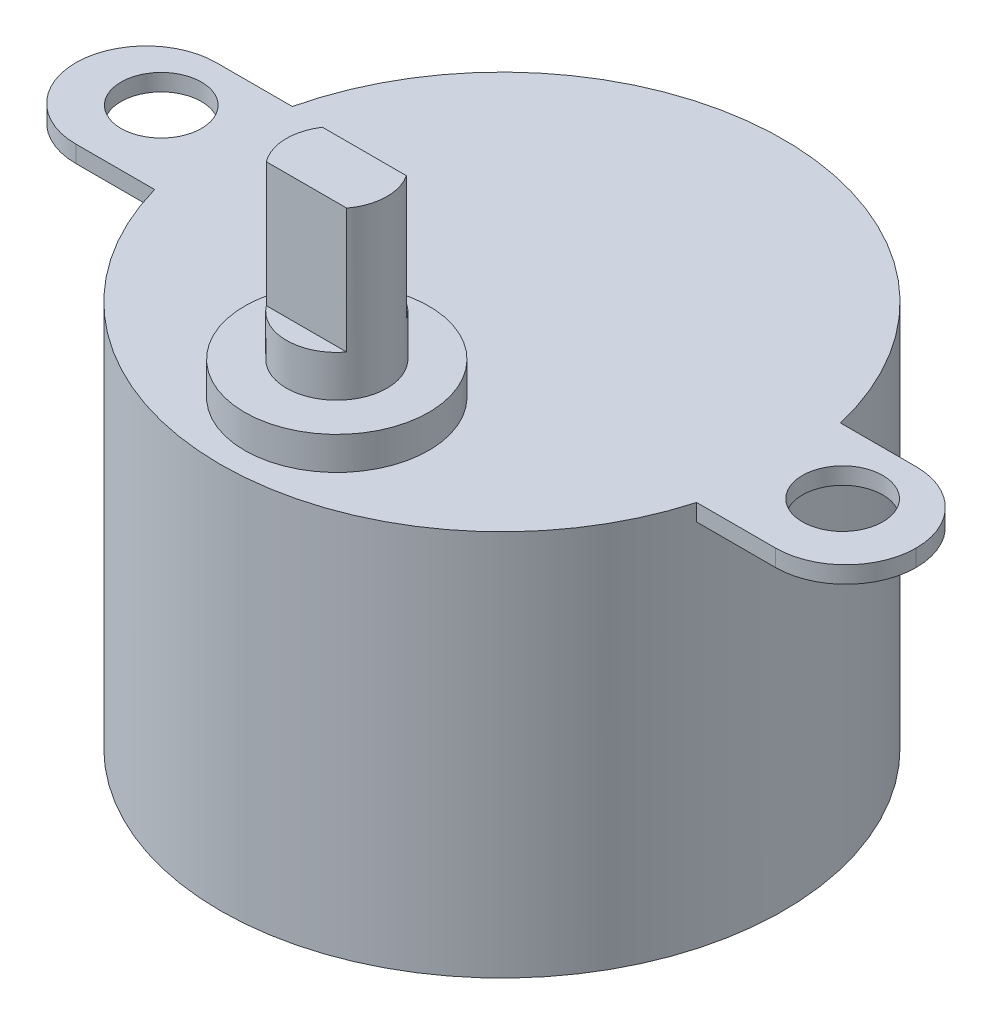
ISO-10303-21;
HEADER;
FILE_DESCRIPTION(('STEP AP214'),'2;1');
FILE_NAME('part.step','',(''),(''),'','','');
FILE_SCHEMA(('AUTOMOTIVE_DESIGN { 1 0 10303 214 1 1 1 1 }'));
ENDSEC;
DATA;
#1=APPLICATION_CONTEXT('core data for automotive mechanical design processes');
#2=APPLICATION_PROTOCOL_DEFINITION('international standard','automotive_design',2000,#1);
#3=PRODUCT_CONTEXT('',#1,'mechanical');
#4=PRODUCT('Part','Part','',(#3));
#5=PRODUCT_RELATED_PRODUCT_CATEGORY('part','',(#4));
#6=PRODUCT_DEFINITION_FORMATION('','',#4);
#7=PRODUCT_DEFINITION_CONTEXT('part definition',#1,'design');
#8=PRODUCT_DEFINITION('design','',#6,#7);
#9=PRODUCT_DEFINITION_SHAPE('','',#8);
#10=(LENGTH_UNIT() NAMED_UNIT(*) SI_UNIT(.MILLI.,.METRE.));
#11=(NAMED_UNIT(*) PLANE_ANGLE_UNIT() SI_UNIT($,.RADIAN.));
#12=(NAMED_UNIT(*) SI_UNIT($,.STERADIAN.) SOLID_ANGLE_UNIT());
#13=UNCERTAINTY_MEASURE_WITH_UNIT(LENGTH_MEASURE(1.E-05),#10,'distance_accuracy_value','');
#14=(GEOMETRIC_REPRESENTATION_CONTEXT(3) GLOBAL_UNCERTAINTY_ASSIGNED_CONTEXT((#13)) GLOBAL_UNIT_ASSIGNED_CONTEXT((#10,
#11,#12)) REPRESENTATION_CONTEXT('',''));
#15=CARTESIAN_POINT('',(0.,0.,0.));
#16=DIRECTION('',(0.,0.,1.));
#17=DIRECTION('',(1.,0.,0.));
#18=AXIS2_PLACEMENT_3D('',#15,#16,#17);
#19=CARTESIAN_POINT('',(0.,19.22,0.));
#20=DIRECTION('',(0.,-1.,0.));
#21=DIRECTION('',(0.,0.,-1.));
#22=AXIS2_PLACEMENT_3D('',#19,#20,#21);
#23=CYLINDRICAL_SURFACE('',#22,14.);
#24=CARTESIAN_POINT('',(0.,18.38,0.));
#25=DIRECTION('',(0.,1.,0.));
#26=DIRECTION('',(0.,0.,1.));
#27=AXIS2_PLACEMENT_3D('',#24,#25,#26);
#28=CIRCLE('',#27,14.);
#29=CARTESIAN_POINT('',(13.4759261087114,18.38,3.7946561784369));
#30=VERTEX_POINT('',#29);
#31=CARTESIAN_POINT('',(13.6281242651205,18.38,-3.2053438215631));
#32=VERTEX_POINT('',#31);
#33=EDGE_CURVE('E245',#30,#32,#28,.T.);
#34=ORIENTED_EDGE('',*,*,#33,.F.);
#35=DIRECTION('',(0.,-1.,0.));
#36=VECTOR('',#35,1.);
#37=CARTESIAN_POINT('',(13.4759261087114,19.22,3.7946561784369));
#38=LINE('',#37,#36);
#39=CARTESIAN_POINT('',(13.4759261087114,19.22,3.7946561784369));
#40=VERTEX_POINT('',#39);
#41=EDGE_CURVE('E229',#30,#40,#38,.F.);
#42=ORIENTED_EDGE('',*,*,#41,.T.);
#43=CARTESIAN_POINT('',(0.,19.22,0.));
#44=DIRECTION('',(0.,1.,0.));
#45=DIRECTION('',(0.,0.,1.));
#46=AXIS2_PLACEMENT_3D('',#43,#44,#45);
#47=CIRCLE('',#46,14.);
#48=CARTESIAN_POINT('',(-13.4759261087114,19.22,3.7946561784369));
#49=VERTEX_POINT('',#48);
#50=EDGE_CURVE('E236',#49,#40,#47,.T.);
#51=ORIENTED_EDGE('',*,*,#50,.F.);
#52=DIRECTION('',(0.,-1.,0.));
#53=VECTOR('',#52,1.);
#54=CARTESIAN_POINT('',(-13.4759261087114,19.22,3.7946561784369));
#55=LINE('',#54,#53);
#56=CARTESIAN_POINT('',(-13.4759261087114,18.38,3.7946561784369));
#57=VERTEX_POINT('',#56);
#58=EDGE_CURVE('E232',#49,#57,#55,.T.);
#59=ORIENTED_EDGE('',*,*,#58,.T.);
#60=CARTESIAN_POINT('',(-13.6281242651205,18.38,-3.2053438215631));
#61=VERTEX_POINT('',#60);
#62=EDGE_CURVE('E242',#61,#57,#28,.T.);
#63=ORIENTED_EDGE('',*,*,#62,.F.);
#64=DIRECTION('',(0.,-1.,0.));
#65=VECTOR('',#64,1.);
#66=CARTESIAN_POINT('',(-13.6281242651205,19.22,-3.2053438215631));
#67=LINE('',#66,#65);
#68=CARTESIAN_POINT('',(-13.6281242651205,19.22,-3.2053438215631));
#69=VERTEX_POINT('',#68);
#70=EDGE_CURVE('E217',#61,#69,#67,.F.);
#71=ORIENTED_EDGE('',*,*,#70,.T.);
#72=CARTESIAN_POINT('',(13.6281242651205,19.22,-3.2053438215631));
#73=VERTEX_POINT('',#72);
#74=EDGE_CURVE('E239',#73,#69,#47,.T.);
#75=ORIENTED_EDGE('',*,*,#74,.F.);
#76=DIRECTION('',(0.,-1.,0.));
#77=VECTOR('',#76,1.);
#78=CARTESIAN_POINT('',(13.6281242651205,19.22,-3.2053438215631));
#79=LINE('',#78,#77);
#80=EDGE_CURVE('E226',#73,#32,#79,.T.);
#81=ORIENTED_EDGE('',*,*,#80,.T.);
#82=EDGE_LOOP('',(#34,#42,#51,#59,#63,#71,#75,#81));
#83=FACE_BOUND('',#82,.T.);
#84=CARTESIAN_POINT('',(0.,0.,0.));
#85=DIRECTION('',(0.,1.,0.));
#86=DIRECTION('',(0.,0.,1.));
#87=AXIS2_PLACEMENT_3D('',#84,#85,#86);
#88=CIRCLE('',#87,14.);
#89=CARTESIAN_POINT('',(0.,0.,14.));
#90=VERTEX_POINT('',#89);
#91=EDGE_CURVE('E235',#90,#90,#88,.T.);
#92=ORIENTED_EDGE('',*,*,#91,.T.);
#93=EDGE_LOOP('',(#92));
#94=FACE_BOUND('',#93,.T.);
#95=ADVANCED_FACE('F63',(#83,#94),#23,.T.);
#96=CARTESIAN_POINT('',(0.,19.22,0.));
#97=DIRECTION('',(0.,1.,0.));
#98=DIRECTION('',(0.,0.,1.));
#99=AXIS2_PLACEMENT_3D('',#96,#97,#98);
#100=PLANE('',#99);
#101=CARTESIAN_POINT('',(0.,19.22,8.2134750257552));
#102=DIRECTION('',(0.,1.,0.));
#103=DIRECTION('',(0.,0.,1.));
#104=AXIS2_PLACEMENT_3D('',#101,#102,#103);
#105=CIRCLE('',#104,4.58);
#106=CARTESIAN_POINT('',(0.,19.22,12.7934750257552));
#107=VERTEX_POINT('',#106);
#108=EDGE_CURVE('E185',#107,#107,#105,.T.);
#109=ORIENTED_EDGE('',*,*,#108,.F.);
#110=EDGE_LOOP('',(#109));
#111=FACE_BOUND('',#110,.T.);
#112=CARTESIAN_POINT('',(-16.9416325596518,19.22,0.));
#113=DIRECTION('',(0.,1.,0.));
#114=DIRECTION('',(0.,0.,1.));
#115=AXIS2_PLACEMENT_3D('',#112,#113,#114);
#116=CIRCLE('',#115,2.);
#117=CARTESIAN_POINT('',(-16.9416325596518,19.22,2.));
#118=VERTEX_POINT('',#117);
#119=EDGE_CURVE('E203',#118,#118,#116,.T.);
#120=ORIENTED_EDGE('',*,*,#119,.F.);
#121=EDGE_LOOP('',(#120));
#122=FACE_BOUND('',#121,.T.);
#123=CARTESIAN_POINT('',(16.9416325596518,19.22,0.));
#124=DIRECTION('',(0.,1.,0.));
#125=DIRECTION('',(0.,0.,-1.));
#126=AXIS2_PLACEMENT_3D('',#123,#124,#125);
#127=CIRCLE('',#126,2.);
#128=CARTESIAN_POINT('',(16.9416325596518,19.22,-2.));
#129=VERTEX_POINT('',#128);
#130=EDGE_CURVE('E196',#129,#129,#127,.T.);
#131=ORIENTED_EDGE('',*,*,#130,.F.);
#132=EDGE_LOOP('',(#131));
#133=FACE_BOUND('',#132,.T.);
#134=CARTESIAN_POINT('',(17.3979228091337,19.22,0.2946561784369));
#135=DIRECTION('',(0.,1.,0.));
#136=DIRECTION('',(0.,0.,1.));
#137=AXIS2_PLACEMENT_3D('',#134,#135,#136);
#138=CIRCLE('',#137,3.5);
#139=CARTESIAN_POINT('',(17.3979228091337,19.22,3.7946561784369));
#140=VERTEX_POINT('',#139);
#141=CARTESIAN_POINT('',(20.8979228091337,19.22,0.2946561784369));
#142=VERTEX_POINT('',#141);
#143=EDGE_CURVE('E250',#140,#142,#138,.T.);
#144=ORIENTED_EDGE('',*,*,#143,.T.);
#145=CARTESIAN_POINT('',(17.3979228091337,19.22,0.2946561784369));
#146=DIRECTION('',(0.,1.,0.));
#147=DIRECTION('',(0.,0.,1.));
#148=AXIS2_PLACEMENT_3D('',#145,#146,#147);
#149=CIRCLE('',#148,3.5);
#150=CARTESIAN_POINT('',(17.3979228091337,19.22,-3.2053438215631));
#151=VERTEX_POINT('',#150);
#152=EDGE_CURVE('E252',#142,#151,#149,.T.);
#153=ORIENTED_EDGE('',*,*,#152,.T.);
#154=DIRECTION('',(-1.,0.,0.));
#155=VECTOR('',#154,1.);
#156=CARTESIAN_POINT('',(-20.8979228091337,19.22,-3.2053438215631));
#157=LINE('',#156,#155);
#158=EDGE_CURVE('E222',#151,#73,#157,.T.);
#159=ORIENTED_EDGE('',*,*,#158,.T.);
#160=ORIENTED_EDGE('',*,*,#74,.T.);
#161=CARTESIAN_POINT('',(-17.3979228091337,19.22,-3.2053438215631));
#162=VERTEX_POINT('',#161);
#163=EDGE_CURVE('E220',#69,#162,#157,.T.);
#164=ORIENTED_EDGE('',*,*,#163,.T.);
#165=CARTESIAN_POINT('',(-17.3979228091337,19.22,0.2946561784369));
#166=DIRECTION('',(0.,1.,0.));
#167=DIRECTION('',(0.,0.,1.));
#168=AXIS2_PLACEMENT_3D('',#165,#166,#167);
#169=CIRCLE('',#168,3.5);
#170=CARTESIAN_POINT('',(-20.8979228091337,19.22,0.294656178436901));
#171=VERTEX_POINT('',#170);
#172=EDGE_CURVE('E248',#162,#171,#169,.T.);
#173=ORIENTED_EDGE('',*,*,#172,.T.);
#174=CARTESIAN_POINT('',(-17.3979228091337,19.22,0.2946561784369));
#175=DIRECTION('',(0.,1.,0.));
#176=DIRECTION('',(0.,0.,1.));
#177=AXIS2_PLACEMENT_3D('',#174,#175,#176);
#178=CIRCLE('',#177,3.5);
#179=CARTESIAN_POINT('',(-17.3979228091337,19.22,3.7946561784369));
#180=VERTEX_POINT('',#179);
#181=EDGE_CURVE('E246',#171,#180,#178,.T.);
#182=ORIENTED_EDGE('',*,*,#181,.T.);
#183=DIRECTION('',(1.,0.,0.));
#184=VECTOR('',#183,1.);
#185=CARTESIAN_POINT('',(20.8979228091337,19.22,3.7946561784369));
#186=LINE('',#185,#184);
#187=EDGE_CURVE('E218',#180,#49,#186,.T.);
#188=ORIENTED_EDGE('',*,*,#187,.T.);
#189=ORIENTED_EDGE('',*,*,#50,.T.);
#190=EDGE_CURVE('E221',#40,#140,#186,.T.);
#191=ORIENTED_EDGE('',*,*,#190,.T.);
#192=EDGE_LOOP('',(#144,#153,#159,#160,#164,#173,#182,#188,#189,#191));
#193=FACE_BOUND('',#192,.T.);
#194=ADVANCED_FACE('F295',(#111,#122,#133,#193),#100,.T.);
#195=CARTESIAN_POINT('',(0.,0.,0.));
#196=DIRECTION('',(0.,1.,0.));
#197=DIRECTION('',(0.,0.,1.));
#198=AXIS2_PLACEMENT_3D('',#195,#196,#197);
#199=PLANE('',#198);
#200=ORIENTED_EDGE('',*,*,#91,.F.);
#201=EDGE_LOOP('',(#200));
#202=FACE_BOUND('',#201,.T.);
#203=ADVANCED_FACE('F301',(#202),#199,.F.);
#204=CARTESIAN_POINT('',(0.,18.38,0.));
#205=DIRECTION('',(0.,1.,0.));
#206=DIRECTION('',(0.,0.,1.));
#207=AXIS2_PLACEMENT_3D('',#204,#205,#206);
#208=PLANE('',#207);
#209=CARTESIAN_POINT('',(-16.9416325596518,18.38,0.));
#210=DIRECTION('',(0.,1.,0.));
#211=DIRECTION('',(0.,0.,1.));
#212=AXIS2_PLACEMENT_3D('',#209,#210,#211);
#213=CIRCLE('',#212,2.);
#214=CARTESIAN_POINT('',(-16.9416325596518,18.38,2.));
#215=VERTEX_POINT('',#214);
#216=EDGE_CURVE('E199',#215,#215,#213,.T.);
#217=ORIENTED_EDGE('',*,*,#216,.T.);
#218=EDGE_LOOP('',(#217));
#219=FACE_BOUND('',#218,.T.);
#220=CARTESIAN_POINT('',(-17.3979228091337,18.38,0.2946561784369));
#221=DIRECTION('',(0.,1.,0.));
#222=DIRECTION('',(0.,0.,1.));
#223=AXIS2_PLACEMENT_3D('',#220,#221,#222);
#224=CIRCLE('',#223,3.5);
#225=CARTESIAN_POINT('',(-17.3979228091337,18.38,3.7946561784369));
#226=VERTEX_POINT('',#225);
#227=CARTESIAN_POINT('',(-20.8979228091337,18.38,0.294656178436901));
#228=VERTEX_POINT('',#227);
#229=EDGE_CURVE('E266',#226,#228,#224,.F.);
#230=ORIENTED_EDGE('',*,*,#229,.T.);
#231=CARTESIAN_POINT('',(-17.3979228091337,18.38,0.2946561784369));
#232=DIRECTION('',(0.,1.,0.));
#233=DIRECTION('',(0.,0.,1.));
#234=AXIS2_PLACEMENT_3D('',#231,#232,#233);
#235=CIRCLE('',#234,3.5);
#236=CARTESIAN_POINT('',(-17.3979228091337,18.38,-3.2053438215631));
#237=VERTEX_POINT('',#236);
#238=EDGE_CURVE('E268',#228,#237,#235,.F.);
#239=ORIENTED_EDGE('',*,*,#238,.T.);
#240=DIRECTION('',(-1.,0.,0.));
#241=VECTOR('',#240,1.);
#242=CARTESIAN_POINT('',(-20.8979228091337,18.38,-3.2053438215631));
#243=LINE('',#242,#241);
#244=EDGE_CURVE('E213',#61,#237,#243,.T.);
#245=ORIENTED_EDGE('',*,*,#244,.F.);
#246=ORIENTED_EDGE('',*,*,#62,.T.);
#247=DIRECTION('',(1.,0.,0.));
#248=VECTOR('',#247,1.);
#249=CARTESIAN_POINT('',(20.8979228091337,18.38,3.7946561784369));
#250=LINE('',#249,#248);
#251=EDGE_CURVE('E211',#226,#57,#250,.T.);
#252=ORIENTED_EDGE('',*,*,#251,.F.);
#253=EDGE_LOOP('',(#230,#239,#245,#246,#252));
#254=FACE_BOUND('',#253,.T.);
#255=ADVANCED_FACE('F334',(#219,#254),#208,.F.);
#256=CARTESIAN_POINT('',(-20.8979228091337,18.38,-3.2053438215631));
#257=DIRECTION('',(0.,0.,-1.));
#258=DIRECTION('',(-1.,0.,0.));
#259=AXIS2_PLACEMENT_3D('',#256,#257,#258);
#260=PLANE('',#259);
#261=ORIENTED_EDGE('',*,*,#244,.T.);
#262=DIRECTION('',(0.,1.,0.));
#263=VECTOR('',#262,1.);
#264=CARTESIAN_POINT('',(-17.3979228091337,18.38,-3.2053438215631));
#265=LINE('',#264,#263);
#266=EDGE_CURVE('E263',#237,#162,#265,.T.);
#267=ORIENTED_EDGE('',*,*,#266,.T.);
#268=ORIENTED_EDGE('',*,*,#163,.F.);
#269=ORIENTED_EDGE('',*,*,#70,.F.);
#270=EDGE_LOOP('',(#261,#267,#268,#269));
#271=FACE_BOUND('',#270,.T.);
#272=ADVANCED_FACE('F339',(#271),#260,.T.);
#273=CARTESIAN_POINT('',(20.8979228091337,18.38,3.7946561784369));
#274=DIRECTION('',(0.,0.,1.));
#275=DIRECTION('',(1.,0.,0.));
#276=AXIS2_PLACEMENT_3D('',#273,#274,#275);
#277=PLANE('',#276);
#278=ORIENTED_EDGE('',*,*,#187,.F.);
#279=DIRECTION('',(0.,1.,0.));
#280=VECTOR('',#279,1.);
#281=CARTESIAN_POINT('',(-17.3979228091337,18.38,3.7946561784369));
#282=LINE('',#281,#280);
#283=EDGE_CURVE('E192',#180,#226,#282,.F.);
#284=ORIENTED_EDGE('',*,*,#283,.T.);
#285=ORIENTED_EDGE('',*,*,#251,.T.);
#286=ORIENTED_EDGE('',*,*,#58,.F.);
#287=EDGE_LOOP('',(#278,#284,#285,#286));
#288=FACE_BOUND('',#287,.T.);
#289=ADVANCED_FACE('F366',(#288),#277,.T.);
#290=CARTESIAN_POINT('',(16.9416325596518,18.38,0.));
#291=DIRECTION('',(0.,1.,0.));
#292=DIRECTION('',(0.,0.,-1.));
#293=AXIS2_PLACEMENT_3D('',#290,#291,#292);
#294=CIRCLE('',#293,2.);
#295=CARTESIAN_POINT('',(16.9416325596518,18.38,-2.));
#296=VERTEX_POINT('',#295);
#297=EDGE_CURVE('E206',#296,#296,#294,.T.);
#298=ORIENTED_EDGE('',*,*,#297,.T.);
#299=EDGE_LOOP('',(#298));
#300=FACE_BOUND('',#299,.T.);
#301=CARTESIAN_POINT('',(17.3979228091337,18.38,-3.2053438215631));
#302=VERTEX_POINT('',#301);
#303=EDGE_CURVE('E215',#302,#32,#243,.T.);
#304=ORIENTED_EDGE('',*,*,#303,.F.);
#305=CARTESIAN_POINT('',(17.3979228091337,18.38,0.2946561784369));
#306=DIRECTION('',(0.,1.,0.));
#307=DIRECTION('',(0.,0.,1.));
#308=AXIS2_PLACEMENT_3D('',#305,#306,#307);
#309=CIRCLE('',#308,3.5);
#310=CARTESIAN_POINT('',(20.8979228091337,18.38,0.2946561784369));
#311=VERTEX_POINT('',#310);
#312=EDGE_CURVE('E259',#302,#311,#309,.F.);
#313=ORIENTED_EDGE('',*,*,#312,.T.);
#314=CARTESIAN_POINT('',(17.3979228091337,18.38,0.2946561784369));
#315=DIRECTION('',(0.,1.,0.));
#316=DIRECTION('',(0.,0.,1.));
#317=AXIS2_PLACEMENT_3D('',#314,#315,#316);
#318=CIRCLE('',#317,3.5);
#319=CARTESIAN_POINT('',(17.3979228091337,18.38,3.7946561784369));
#320=VERTEX_POINT('',#319);
#321=EDGE_CURVE('E257',#311,#320,#318,.F.);
#322=ORIENTED_EDGE('',*,*,#321,.T.);
#323=EDGE_CURVE('E214',#30,#320,#250,.T.);
#324=ORIENTED_EDGE('',*,*,#323,.F.);
#325=ORIENTED_EDGE('',*,*,#33,.T.);
#326=EDGE_LOOP('',(#304,#313,#322,#324,#325));
#327=FACE_BOUND('',#326,.T.);
#328=ADVANCED_FACE('F354',(#300,#327),#208,.F.);
#329=ORIENTED_EDGE('',*,*,#323,.T.);
#330=DIRECTION('',(0.,1.,0.));
#331=VECTOR('',#330,1.);
#332=CARTESIAN_POINT('',(17.3979228091337,18.38,3.7946561784369));
#333=LINE('',#332,#331);
#334=EDGE_CURVE('E261',#320,#140,#333,.T.);
#335=ORIENTED_EDGE('',*,*,#334,.T.);
#336=ORIENTED_EDGE('',*,*,#190,.F.);
#337=ORIENTED_EDGE('',*,*,#41,.F.);
#338=EDGE_LOOP('',(#329,#335,#336,#337));
#339=FACE_BOUND('',#338,.T.);
#340=ADVANCED_FACE('F359',(#339),#277,.T.);
#341=ORIENTED_EDGE('',*,*,#158,.F.);
#342=DIRECTION('',(0.,1.,0.));
#343=VECTOR('',#342,1.);
#344=CARTESIAN_POINT('',(17.3979228091337,18.38,-3.2053438215631));
#345=LINE('',#344,#343);
#346=EDGE_CURVE('E254',#151,#302,#345,.F.);
#347=ORIENTED_EDGE('',*,*,#346,.T.);
#348=ORIENTED_EDGE('',*,*,#303,.T.);
#349=ORIENTED_EDGE('',*,*,#80,.F.);
#350=EDGE_LOOP('',(#341,#347,#348,#349));
#351=FACE_BOUND('',#350,.T.);
#352=ADVANCED_FACE('F314',(#351),#260,.T.);
#353=CARTESIAN_POINT('',(17.3979228091337,18.38,0.2946561784369));
#354=DIRECTION('',(0.,1.,0.));
#355=DIRECTION('',(0.,0.,1.));
#356=AXIS2_PLACEMENT_3D('',#353,#354,#355);
#357=CYLINDRICAL_SURFACE('',#356,3.5);
#358=ORIENTED_EDGE('',*,*,#334,.F.);
#359=ORIENTED_EDGE('',*,*,#321,.F.);
#360=DIRECTION('',(0.,1.,0.));
#361=VECTOR('',#360,1.);
#362=CARTESIAN_POINT('',(20.8979228091337,18.38,0.2946561784369));
#363=LINE('',#362,#361);
#364=EDGE_CURVE('E271',#142,#311,#363,.F.);
#365=ORIENTED_EDGE('',*,*,#364,.F.);
#366=ORIENTED_EDGE('',*,*,#143,.F.);
#367=EDGE_LOOP('',(#358,#359,#365,#366));
#368=FACE_BOUND('',#367,.T.);
#369=ADVANCED_FACE('F311',(#368),#357,.T.);
#370=CARTESIAN_POINT('',(17.3979228091337,18.38,0.2946561784369));
#371=DIRECTION('',(0.,1.,0.));
#372=DIRECTION('',(0.,0.,1.));
#373=AXIS2_PLACEMENT_3D('',#370,#371,#372);
#374=CYLINDRICAL_SURFACE('',#373,3.5);
#375=ORIENTED_EDGE('',*,*,#312,.F.);
#376=ORIENTED_EDGE('',*,*,#346,.F.);
#377=ORIENTED_EDGE('',*,*,#152,.F.);
#378=ORIENTED_EDGE('',*,*,#364,.T.);
#379=EDGE_LOOP('',(#375,#376,#377,#378));
#380=FACE_BOUND('',#379,.T.);
#381=ADVANCED_FACE('F308',(#380),#374,.T.);
#382=CARTESIAN_POINT('',(-17.3979228091337,18.38,0.2946561784369));
#383=DIRECTION('',(0.,1.,0.));
#384=DIRECTION('',(0.,0.,1.));
#385=AXIS2_PLACEMENT_3D('',#382,#383,#384);
#386=CYLINDRICAL_SURFACE('',#385,3.5);
#387=DIRECTION('',(0.,1.,0.));
#388=VECTOR('',#387,1.);
#389=CARTESIAN_POINT('',(-20.8979228091337,18.38,0.294656178436901));
#390=LINE('',#389,#388);
#391=EDGE_CURVE('E202',#228,#171,#390,.T.);
#392=ORIENTED_EDGE('',*,*,#391,.F.);
#393=ORIENTED_EDGE('',*,*,#229,.F.);
#394=ORIENTED_EDGE('',*,*,#283,.F.);
#395=ORIENTED_EDGE('',*,*,#181,.F.);
#396=EDGE_LOOP('',(#392,#393,#394,#395));
#397=FACE_BOUND('',#396,.T.);
#398=ADVANCED_FACE('F65',(#397),#386,.T.);
#399=CARTESIAN_POINT('',(-17.3979228091337,18.38,0.2946561784369));
#400=DIRECTION('',(0.,1.,0.));
#401=DIRECTION('',(0.,0.,1.));
#402=AXIS2_PLACEMENT_3D('',#399,#400,#401);
#403=CYLINDRICAL_SURFACE('',#402,3.5);
#404=ORIENTED_EDGE('',*,*,#238,.F.);
#405=ORIENTED_EDGE('',*,*,#391,.T.);
#406=ORIENTED_EDGE('',*,*,#172,.F.);
#407=ORIENTED_EDGE('',*,*,#266,.F.);
#408=EDGE_LOOP('',(#404,#405,#406,#407));
#409=FACE_BOUND('',#408,.T.);
#410=ADVANCED_FACE('F316',(#409),#403,.T.);
#411=CARTESIAN_POINT('',(16.9416325596518,18.38,0.));
#412=DIRECTION('',(0.,1.,0.));
#413=DIRECTION('',(0.,0.,1.));
#414=AXIS2_PLACEMENT_3D('',#411,#412,#413);
#415=CYLINDRICAL_SURFACE('',#414,2.);
#416=ORIENTED_EDGE('',*,*,#297,.F.);
#417=EDGE_LOOP('',(#416));
#418=FACE_BOUND('',#417,.T.);
#419=ORIENTED_EDGE('',*,*,#130,.T.);
#420=EDGE_LOOP('',(#419));
#421=FACE_BOUND('',#420,.T.);
#422=ADVANCED_FACE('F318',(#418,#421),#415,.F.);
#423=CARTESIAN_POINT('',(-16.9416325596518,18.38,0.));
#424=DIRECTION('',(0.,1.,0.));
#425=DIRECTION('',(0.,0.,1.));
#426=AXIS2_PLACEMENT_3D('',#423,#424,#425);
#427=CYLINDRICAL_SURFACE('',#426,2.);
#428=ORIENTED_EDGE('',*,*,#216,.F.);
#429=EDGE_LOOP('',(#428));
#430=FACE_BOUND('',#429,.T.);
#431=ORIENTED_EDGE('',*,*,#119,.T.);
#432=EDGE_LOOP('',(#431));
#433=FACE_BOUND('',#432,.T.);
#434=ADVANCED_FACE('F324',(#430,#433),#427,.F.);
#435=CARTESIAN_POINT('',(0.,20.86,8.2134750257552));
#436=DIRECTION('',(0.,-1.,0.));
#437=DIRECTION('',(0.,0.,-1.));
#438=AXIS2_PLACEMENT_3D('',#435,#436,#437);
#439=CYLINDRICAL_SURFACE('',#438,4.58);
#440=CARTESIAN_POINT('',(0.,20.86,8.2134750257552));
#441=DIRECTION('',(0.,1.,0.));
#442=DIRECTION('',(0.,0.,1.));
#443=AXIS2_PLACEMENT_3D('',#440,#441,#442);
#444=CIRCLE('',#443,4.58);
#445=CARTESIAN_POINT('',(0.,20.86,12.7934750257552));
#446=VERTEX_POINT('',#445);
#447=EDGE_CURVE('E193',#446,#446,#444,.T.);
#448=ORIENTED_EDGE('',*,*,#447,.F.);
#449=EDGE_LOOP('',(#448));
#450=FACE_BOUND('',#449,.T.);
#451=ORIENTED_EDGE('',*,*,#108,.T.);
#452=EDGE_LOOP('',(#451));
#453=FACE_BOUND('',#452,.T.);
#454=ADVANCED_FACE('F389',(#450,#453),#439,.T.);
#455=CARTESIAN_POINT('',(0.,20.86,8.2134750257552));
#456=DIRECTION('',(0.,1.,0.));
#457=DIRECTION('',(0.,0.,1.));
#458=AXIS2_PLACEMENT_3D('',#455,#456,#457);
#459=PLANE('',#458);
#460=CARTESIAN_POINT('',(0.,20.86,8.2134750257552));
#461=DIRECTION('',(0.,1.,0.));
#462=DIRECTION('',(0.,0.,1.));
#463=AXIS2_PLACEMENT_3D('',#460,#461,#462);
#464=CIRCLE('',#463,2.5);
#465=CARTESIAN_POINT('',(0.,20.86,10.7134750257552));
#466=VERTEX_POINT('',#465);
#467=EDGE_CURVE('E172',#466,#466,#464,.T.);
#468=ORIENTED_EDGE('',*,*,#467,.F.);
#469=EDGE_LOOP('',(#468));
#470=FACE_BOUND('',#469,.T.);
#471=ORIENTED_EDGE('',*,*,#447,.T.);
#472=EDGE_LOOP('',(#471));
#473=FACE_BOUND('',#472,.T.);
#474=ADVANCED_FACE('F393',(#470,#473),#459,.T.);
#475=CARTESIAN_POINT('',(0.,29.12,8.2134750257552));
#476=DIRECTION('',(0.,-1.,0.));
#477=DIRECTION('',(0.,0.,-1.));
#478=AXIS2_PLACEMENT_3D('',#475,#476,#477);
#479=CYLINDRICAL_SURFACE('',#478,2.5);
#480=CARTESIAN_POINT('',(0.,29.12,8.2134750257552));
#481=DIRECTION('',(0.,1.,0.));
#482=DIRECTION('',(0.,0.,1.));
#483=AXIS2_PLACEMENT_3D('',#480,#481,#482);
#484=CIRCLE('',#483,2.5);
#485=CARTESIAN_POINT('',(-2.08797267779774,29.12,6.83856772096329));
#486=VERTEX_POINT('',#485);
#487=CARTESIAN_POINT('',(-1.99617032811112,29.12,9.71856772096329));
#488=VERTEX_POINT('',#487);
#489=EDGE_CURVE('E179',#486,#488,#484,.T.);
#490=ORIENTED_EDGE('',*,*,#489,.F.);
#491=DIRECTION('',(0.,-1.,0.));
#492=VECTOR('',#491,1.);
#493=CARTESIAN_POINT('',(-2.08797267779774,29.12,6.83856772096329));
#494=LINE('',#493,#492);
#495=CARTESIAN_POINT('',(-2.08797267779774,22.92,6.83856772096329));
#496=VERTEX_POINT('',#495);
#497=EDGE_CURVE('E78',#486,#496,#494,.T.);
#498=ORIENTED_EDGE('',*,*,#497,.T.);
#499=CARTESIAN_POINT('',(0.,22.92,8.2134750257552));
#500=DIRECTION('',(0.,1.,0.));
#501=DIRECTION('',(0.,0.,1.));
#502=AXIS2_PLACEMENT_3D('',#499,#500,#501);
#503=CIRCLE('',#502,2.5);
#504=CARTESIAN_POINT('',(2.08797267779774,22.92,6.83856772096329));
#505=VERTEX_POINT('',#504);
#506=EDGE_CURVE('E13',#505,#496,#503,.T.);
#507=ORIENTED_EDGE('',*,*,#506,.F.);
#508=DIRECTION('',(0.,-1.,0.));
#509=VECTOR('',#508,1.);
#510=CARTESIAN_POINT('',(2.08797267779774,29.12,6.83856772096329));
#511=LINE('',#510,#509);
#512=CARTESIAN_POINT('',(2.08797267779774,29.12,6.83856772096329));
#513=VERTEX_POINT('',#512);
#514=EDGE_CURVE('E186',#505,#513,#511,.F.);
#515=ORIENTED_EDGE('',*,*,#514,.T.);
#516=CARTESIAN_POINT('',(1.99617032811112,29.12,9.71856772096329));
#517=VERTEX_POINT('',#516);
#518=EDGE_CURVE('E183',#517,#513,#484,.T.);
#519=ORIENTED_EDGE('',*,*,#518,.F.);
#520=DIRECTION('',(0.,-1.,0.));
#521=VECTOR('',#520,1.);
#522=CARTESIAN_POINT('',(1.99617032811112,29.12,9.71856772096329));
#523=LINE('',#522,#521);
#524=CARTESIAN_POINT('',(1.99617032811112,22.92,9.71856772096329));
#525=VERTEX_POINT('',#524);
#526=EDGE_CURVE('E86',#517,#525,#523,.T.);
#527=ORIENTED_EDGE('',*,*,#526,.T.);
#528=CARTESIAN_POINT('',(-1.99617032811112,22.92,9.71856772096329));
#529=VERTEX_POINT('',#528);
#530=EDGE_CURVE('E67',#529,#525,#503,.T.);
#531=ORIENTED_EDGE('',*,*,#530,.F.);
#532=DIRECTION('',(0.,-1.,0.));
#533=VECTOR('',#532,1.);
#534=CARTESIAN_POINT('',(-1.99617032811112,29.12,9.71856772096329));
#535=LINE('',#534,#533);
#536=EDGE_CURVE('E165',#529,#488,#535,.F.);
#537=ORIENTED_EDGE('',*,*,#536,.T.);
#538=EDGE_LOOP('',(#490,#498,#507,#515,#519,#527,#531,#537));
#539=FACE_BOUND('',#538,.T.);
#540=ORIENTED_EDGE('',*,*,#467,.T.);
#541=EDGE_LOOP('',(#540));
#542=FACE_BOUND('',#541,.T.);
#543=ADVANCED_FACE('F177',(#539,#542),#479,.T.);
#544=CARTESIAN_POINT('',(0.,29.12,8.2134750257552));
#545=DIRECTION('',(0.,1.,0.));
#546=DIRECTION('',(0.,0.,1.));
#547=AXIS2_PLACEMENT_3D('',#544,#545,#546);
#548=PLANE('',#547);
#549=DIRECTION('',(1.,0.,0.));
#550=VECTOR('',#549,1.);
#551=CARTESIAN_POINT('',(0.,29.12,6.83856772096329));
#552=LINE('',#551,#550);
#553=EDGE_CURVE('E171',#486,#513,#552,.T.);
#554=ORIENTED_EDGE('',*,*,#553,.F.);
#555=ORIENTED_EDGE('',*,*,#489,.T.);
#556=DIRECTION('',(-1.,0.,0.));
#557=VECTOR('',#556,1.);
#558=CARTESIAN_POINT('',(0.,29.12,9.71856772096329));
#559=LINE('',#558,#557);
#560=EDGE_CURVE('E162',#517,#488,#559,.T.);
#561=ORIENTED_EDGE('',*,*,#560,.F.);
#562=ORIENTED_EDGE('',*,*,#518,.T.);
#563=EDGE_LOOP('',(#554,#555,#561,#562));
#564=FACE_BOUND('',#563,.T.);
#565=ADVANCED_FACE('F182',(#564),#548,.T.);
#566=CARTESIAN_POINT('',(3.07768811990439,22.92,9.71856772096329));
#567=DIRECTION('',(0.,0.,-1.));
#568=DIRECTION('',(-1.,0.,0.));
#569=AXIS2_PLACEMENT_3D('',#566,#567,#568);
#570=PLANE('',#569);
#571=ORIENTED_EDGE('',*,*,#560,.T.);
#572=ORIENTED_EDGE('',*,*,#536,.F.);
#573=DIRECTION('',(-1.,0.,0.));
#574=VECTOR('',#573,1.);
#575=CARTESIAN_POINT('',(3.07768811990439,22.92,9.71856772096329));
#576=LINE('',#575,#574);
#577=EDGE_CURVE('E180',#525,#529,#576,.T.);
#578=ORIENTED_EDGE('',*,*,#577,.F.);
#579=ORIENTED_EDGE('',*,*,#526,.F.);
#580=EDGE_LOOP('',(#571,#572,#578,#579));
#581=FACE_BOUND('',#580,.T.);
#582=ADVANCED_FACE('F164',(#581),#570,.F.);
#583=CARTESIAN_POINT('',(0.,22.92,0.));
#584=DIRECTION('',(0.,1.,0.));
#585=DIRECTION('',(0.,0.,1.));
#586=AXIS2_PLACEMENT_3D('',#583,#584,#585);
#587=PLANE('',#586);
#588=ORIENTED_EDGE('',*,*,#530,.T.);
#589=ORIENTED_EDGE('',*,*,#577,.T.);
#590=EDGE_LOOP('',(#588,#589));
#591=FACE_BOUND('',#590,.T.);
#592=ADVANCED_FACE('F277',(#591),#587,.T.);
#593=ORIENTED_EDGE('',*,*,#506,.T.);
#594=DIRECTION('',(1.,0.,0.));
#595=VECTOR('',#594,1.);
#596=CARTESIAN_POINT('',(-3.0776881199044,22.92,6.83856772096329));
#597=LINE('',#596,#595);
#598=EDGE_CURVE('E278',#496,#505,#597,.T.);
#599=ORIENTED_EDGE('',*,*,#598,.T.);
#600=EDGE_LOOP('',(#593,#599));
#601=FACE_BOUND('',#600,.T.);
#602=ADVANCED_FACE('F285',(#601),#587,.T.);
#603=CARTESIAN_POINT('',(-3.0776881199044,22.92,6.83856772096329));
#604=DIRECTION('',(0.,0.,1.));
#605=DIRECTION('',(1.,0.,0.));
#606=AXIS2_PLACEMENT_3D('',#603,#604,#605);
#607=PLANE('',#606);
#608=ORIENTED_EDGE('',*,*,#553,.T.);
#609=ORIENTED_EDGE('',*,*,#514,.F.);
#610=ORIENTED_EDGE('',*,*,#598,.F.);
#611=ORIENTED_EDGE('',*,*,#497,.F.);
#612=EDGE_LOOP('',(#608,#609,#610,#611));
#613=FACE_BOUND('',#612,.T.);
#614=ADVANCED_FACE('F286',(#613),#607,.F.);
#615=CLOSED_SHELL('',(#95,#194,#203,#255,#272,#289,#328,#340,#352,#369,#381,#398,#410,#422,#434,
#454,#474,#543,#565,#582,#592,#602,#614));
#616=MANIFOLD_SOLID_BREP('B2',#615);
#617=ADVANCED_BREP_SHAPE_REPRESENTATION('',(#18,#616),#14);
#618=SHAPE_DEFINITION_REPRESENTATION(#9,#617);
ENDSEC;
END-ISO-10303-21;
